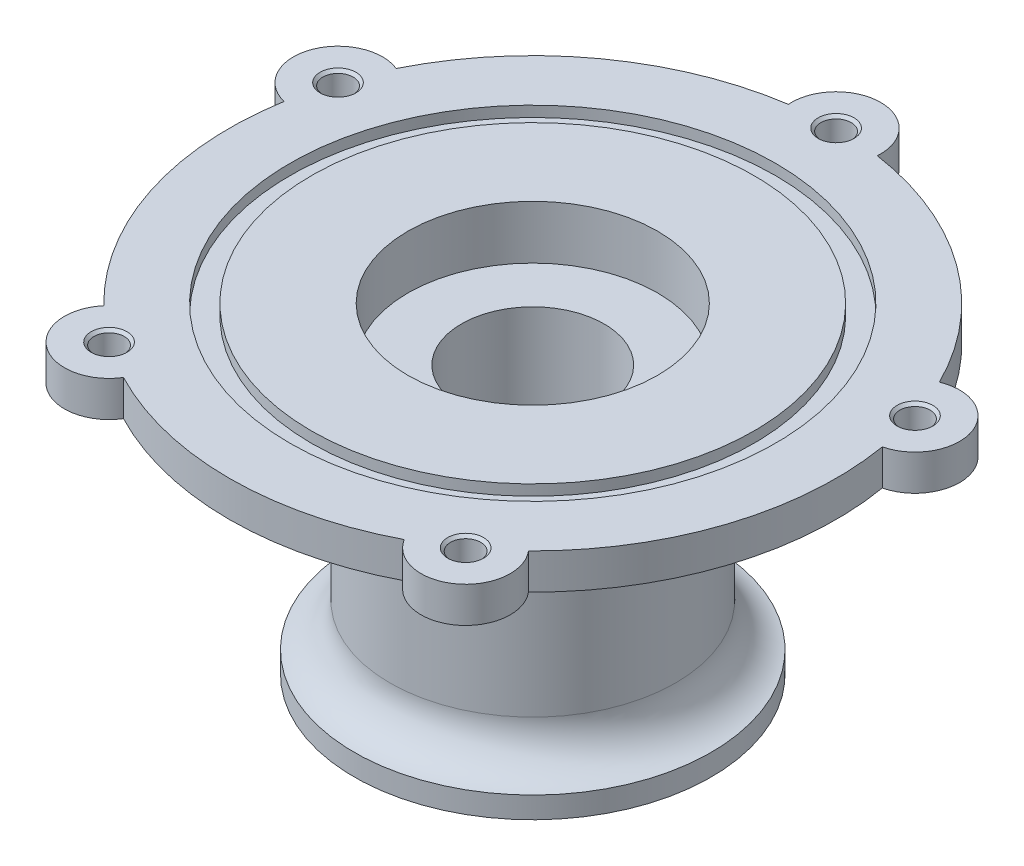
ISO-10303-21;
HEADER;
FILE_DESCRIPTION(('STEP AP214'),'2;1');
FILE_NAME('part.step','',(''),(''),'','','');
FILE_SCHEMA(('AUTOMOTIVE_DESIGN { 1 0 10303 214 1 1 1 1 }'));
ENDSEC;
DATA;
#1=APPLICATION_CONTEXT('core data for automotive mechanical design processes');
#2=APPLICATION_PROTOCOL_DEFINITION('international standard','automotive_design',2000,#1);
#3=PRODUCT_CONTEXT('',#1,'mechanical');
#4=PRODUCT('Part','Part','',(#3));
#5=PRODUCT_RELATED_PRODUCT_CATEGORY('part','',(#4));
#6=PRODUCT_DEFINITION_FORMATION('','',#4);
#7=PRODUCT_DEFINITION_CONTEXT('part definition',#1,'design');
#8=PRODUCT_DEFINITION('design','',#6,#7);
#9=PRODUCT_DEFINITION_SHAPE('','',#8);
#10=(LENGTH_UNIT() NAMED_UNIT(*) SI_UNIT(.MILLI.,.METRE.));
#11=(NAMED_UNIT(*) PLANE_ANGLE_UNIT() SI_UNIT($,.RADIAN.));
#12=(NAMED_UNIT(*) SI_UNIT($,.STERADIAN.) SOLID_ANGLE_UNIT());
#13=UNCERTAINTY_MEASURE_WITH_UNIT(LENGTH_MEASURE(1.E-05),#10,'distance_accuracy_value','');
#14=(GEOMETRIC_REPRESENTATION_CONTEXT(3) GLOBAL_UNCERTAINTY_ASSIGNED_CONTEXT((#13)) GLOBAL_UNIT_ASSIGNED_CONTEXT((#10,
#11,#12)) REPRESENTATION_CONTEXT('',''));
#15=CARTESIAN_POINT('',(0.,0.,0.));
#16=DIRECTION('',(0.,0.,1.));
#17=DIRECTION('',(1.,0.,0.));
#18=AXIS2_PLACEMENT_3D('',#15,#16,#17);
#19=CARTESIAN_POINT('',(0.,0.,0.));
#20=DIRECTION('',(0.,-1.,0.));
#21=DIRECTION('',(0.,0.,-1.));
#22=AXIS2_PLACEMENT_3D('',#19,#20,#21);
#23=CYLINDRICAL_SURFACE('',#22,85.);
#24=CARTESIAN_POINT('',(0.,80.,0.));
#25=DIRECTION('',(0.,-1.,0.));
#26=DIRECTION('',(0.,0.,-1.));
#27=AXIS2_PLACEMENT_3D('',#24,#25,#26);
#28=CIRCLE('',#27,85.);
#29=CARTESIAN_POINT('',(83.8179273140658,80.,-14.1263958876278));
#30=VERTEX_POINT('',#29);
#31=CARTESIAN_POINT('',(59.5068404595702,80.,60.6954358952901));
#32=VERTEX_POINT('',#31);
#33=EDGE_CURVE('E148',#30,#32,#28,.T.);
#34=ORIENTED_EDGE('',*,*,#33,.F.);
#35=DIRECTION('',(0.,1.,0.));
#36=VECTOR('',#35,1.);
#37=CARTESIAN_POINT('',(83.8179273140658,49.935394937421,-14.1263958876278));
#38=LINE('',#37,#36);
#39=CARTESIAN_POINT('',(83.8179273140658,90.,-14.1263958876278));
#40=VERTEX_POINT('',#39);
#41=EDGE_CURVE('E131',#30,#40,#38,.T.);
#42=ORIENTED_EDGE('',*,*,#41,.T.);
#43=CARTESIAN_POINT('',(0.,90.,0.));
#44=DIRECTION('',(0.,-1.,0.));
#45=DIRECTION('',(0.,0.,-1.));
#46=AXIS2_PLACEMENT_3D('',#43,#44,#45);
#47=CIRCLE('',#46,85.);
#48=CARTESIAN_POINT('',(59.5068404595702,90.,60.6954358952901));
#49=VERTEX_POINT('',#48);
#50=EDGE_CURVE('E146',#40,#49,#47,.T.);
#51=ORIENTED_EDGE('',*,*,#50,.T.);
#52=DIRECTION('',(0.,1.,0.));
#53=VECTOR('',#52,1.);
#54=CARTESIAN_POINT('',(59.5068404595702,49.0490885311223,60.6954358952901));
#55=LINE('',#54,#53);
#56=EDGE_CURVE('E238',#32,#49,#55,.T.);
#57=ORIENTED_EDGE('',*,*,#56,.F.);
#58=EDGE_LOOP('',(#34,#42,#51,#57));
#59=FACE_BOUND('',#58,.T.);
#60=ADVANCED_FACE('F49',(#59),#23,.T.);
#61=CARTESIAN_POINT('',(39.3361648340237,80.,75.3502895558506));
#62=VERTEX_POINT('',#61);
#63=CARTESIAN_POINT('',(-39.3361648340247,80.,75.35028955585));
#64=VERTEX_POINT('',#63);
#65=EDGE_CURVE('E332',#62,#64,#28,.T.);
#66=ORIENTED_EDGE('',*,*,#65,.F.);
#67=DIRECTION('',(0.,1.,0.));
#68=VECTOR('',#67,1.);
#69=CARTESIAN_POINT('',(39.3361648340237,49.0490885311223,75.3502895558506));
#70=LINE('',#69,#68);
#71=CARTESIAN_POINT('',(39.3361648340237,90.,75.3502895558506));
#72=VERTEX_POINT('',#71);
#73=EDGE_CURVE('E236',#62,#72,#70,.T.);
#74=ORIENTED_EDGE('',*,*,#73,.T.);
#75=CARTESIAN_POINT('',(-39.3361648340247,90.,75.35028955585));
#76=VERTEX_POINT('',#75);
#77=EDGE_CURVE('E157',#72,#76,#47,.T.);
#78=ORIENTED_EDGE('',*,*,#77,.T.);
#79=DIRECTION('',(0.,1.,0.));
#80=VECTOR('',#79,1.);
#81=CARTESIAN_POINT('',(-39.3361648340247,49.0490885311223,75.35028955585));
#82=LINE('',#81,#80);
#83=EDGE_CURVE('E252',#64,#76,#82,.T.);
#84=ORIENTED_EDGE('',*,*,#83,.F.);
#85=EDGE_LOOP('',(#66,#74,#78,#84));
#86=FACE_BOUND('',#85,.T.);
#87=ADVANCED_FACE('F345',(#86),#23,.T.);
#88=CARTESIAN_POINT('',(-59.506840459571,80.,60.6954358952892));
#89=VERTEX_POINT('',#88);
#90=CARTESIAN_POINT('',(-83.8179273140656,80.,-14.1263958876289));
#91=VERTEX_POINT('',#90);
#92=EDGE_CURVE('E326',#89,#91,#28,.T.);
#93=ORIENTED_EDGE('',*,*,#92,.F.);
#94=DIRECTION('',(0.,1.,0.));
#95=VECTOR('',#94,1.);
#96=CARTESIAN_POINT('',(-59.506840459571,49.0490885311223,60.6954358952892));
#97=LINE('',#96,#95);
#98=CARTESIAN_POINT('',(-59.506840459571,90.,60.6954358952892));
#99=VERTEX_POINT('',#98);
#100=EDGE_CURVE('E75',#89,#99,#97,.T.);
#101=ORIENTED_EDGE('',*,*,#100,.T.);
#102=CARTESIAN_POINT('',(-83.8179273140656,90.,-14.1263958876289));
#103=VERTEX_POINT('',#102);
#104=EDGE_CURVE('E164',#99,#103,#47,.T.);
#105=ORIENTED_EDGE('',*,*,#104,.T.);
#106=DIRECTION('',(0.,1.,0.));
#107=VECTOR('',#106,1.);
#108=CARTESIAN_POINT('',(-83.8179273140656,49.935394937421,-14.1263958876289));
#109=LINE('',#108,#107);
#110=EDGE_CURVE('E262',#91,#103,#109,.T.);
#111=ORIENTED_EDGE('',*,*,#110,.F.);
#112=EDGE_LOOP('',(#93,#101,#105,#111));
#113=FACE_BOUND('',#112,.T.);
#114=ADVANCED_FACE('F353',(#113),#23,.T.);
#115=CARTESIAN_POINT('',(-76.1134148011556,80.,-37.8384472105717));
#116=VERTEX_POINT('',#115);
#117=CARTESIAN_POINT('',(-12.4661631126367,80.,-84.0808823529412));
#118=VERTEX_POINT('',#117);
#119=EDGE_CURVE('E322',#116,#118,#28,.T.);
#120=ORIENTED_EDGE('',*,*,#119,.F.);
#121=DIRECTION('',(0.,1.,0.));
#122=VECTOR('',#121,1.);
#123=CARTESIAN_POINT('',(-76.1134148011556,49.935394937421,-37.8384472105718));
#124=LINE('',#123,#122);
#125=CARTESIAN_POINT('',(-76.1134148011556,90.,-37.8384472105718));
#126=VERTEX_POINT('',#125);
#127=EDGE_CURVE('E67',#116,#126,#124,.T.);
#128=ORIENTED_EDGE('',*,*,#127,.T.);
#129=CARTESIAN_POINT('',(-12.4661631126367,90.,-84.0808823529412));
#130=VERTEX_POINT('',#129);
#131=EDGE_CURVE('E162',#126,#130,#47,.T.);
#132=ORIENTED_EDGE('',*,*,#131,.T.);
#133=DIRECTION('',(0.,1.,0.));
#134=VECTOR('',#133,1.);
#135=CARTESIAN_POINT('',(-12.4661631126367,51.6261966168509,-84.0808823529412));
#136=LINE('',#135,#134);
#137=EDGE_CURVE('E273',#118,#130,#136,.T.);
#138=ORIENTED_EDGE('',*,*,#137,.F.);
#139=EDGE_LOOP('',(#120,#128,#132,#138));
#140=FACE_BOUND('',#139,.T.);
#141=ADVANCED_FACE('F356',(#140),#23,.T.);
#142=CARTESIAN_POINT('',(0.,90.,0.));
#143=DIRECTION('',(0.,-1.,0.));
#144=DIRECTION('',(0.,0.,-1.));
#145=AXIS2_PLACEMENT_3D('',#142,#143,#144);
#146=PLANE('',#145);
#147=CARTESIAN_POINT('',(0.,90.,0.));
#148=DIRECTION('',(0.,1.,0.));
#149=DIRECTION('',(0.,0.,1.));
#150=AXIS2_PLACEMENT_3D('',#147,#148,#149);
#151=CIRCLE('',#150,35.);
#152=CARTESIAN_POINT('',(0.,90.,35.));
#153=VERTEX_POINT('',#152);
#154=EDGE_CURVE('E297',#153,#153,#151,.T.);
#155=ORIENTED_EDGE('',*,*,#154,.F.);
#156=EDGE_LOOP('',(#155));
#157=FACE_BOUND('',#156,.T.);
#158=CARTESIAN_POINT('',(0.,90.,0.));
#159=DIRECTION('',(0.,1.,0.));
#160=DIRECTION('',(0.,0.,1.));
#161=AXIS2_PLACEMENT_3D('',#158,#159,#160);
#162=CIRCLE('',#161,62.);
#163=CARTESIAN_POINT('',(0.,90.,62.));
#164=VERTEX_POINT('',#163);
#165=EDGE_CURVE('E284',#164,#164,#162,.T.);
#166=ORIENTED_EDGE('',*,*,#165,.T.);
#167=EDGE_LOOP('',(#166));
#168=FACE_BOUND('',#167,.T.);
#169=ADVANCED_FACE('F377',(#157,#168),#146,.F.);
#170=CARTESIAN_POINT('',(49.9617464448598,90.,68.7664445218708));
#171=DIRECTION('',(0.,1.,0.));
#172=DIRECTION('',(0.,0.,1.));
#173=AXIS2_PLACEMENT_3D('',#170,#171,#172);
#174=CIRCLE('',#173,5.025);
#175=CARTESIAN_POINT('',(49.9617464448598,90.,73.7914445218708));
#176=VERTEX_POINT('',#175);
#177=EDGE_CURVE('E739',#176,#176,#174,.T.);
#178=ORIENTED_EDGE('',*,*,#177,.F.);
#179=EDGE_LOOP('',(#178));
#180=FACE_BOUND('',#179,.T.);
#181=CARTESIAN_POINT('',(-49.9617464448608,90.,68.7664445218701));
#182=DIRECTION('',(0.,1.,0.));
#183=DIRECTION('',(0.,0.,1.));
#184=AXIS2_PLACEMENT_3D('',#181,#182,#183);
#185=CIRCLE('',#184,5.025);
#186=CARTESIAN_POINT('',(-49.9617464448608,90.,73.7914445218701));
#187=VERTEX_POINT('',#186);
#188=EDGE_CURVE('E204',#187,#187,#185,.T.);
#189=ORIENTED_EDGE('',*,*,#188,.F.);
#190=EDGE_LOOP('',(#189));
#191=FACE_BOUND('',#190,.T.);
#192=CARTESIAN_POINT('',(80.8398038850882,90.,-26.2664445218703));
#193=DIRECTION('',(0.,1.,0.));
#194=DIRECTION('',(0.,0.,1.));
#195=AXIS2_PLACEMENT_3D('',#192,#193,#194);
#196=CIRCLE('',#195,5.025);
#197=CARTESIAN_POINT('',(80.8398038850882,90.,-21.2414445218703));
#198=VERTEX_POINT('',#197);
#199=EDGE_CURVE('E195',#198,#198,#196,.T.);
#200=ORIENTED_EDGE('',*,*,#199,.F.);
#201=EDGE_LOOP('',(#200));
#202=FACE_BOUND('',#201,.T.);
#203=CARTESIAN_POINT('',(0.,90.,-85.));
#204=DIRECTION('',(0.,1.,0.));
#205=DIRECTION('',(0.,0.,1.));
#206=AXIS2_PLACEMENT_3D('',#203,#204,#205);
#207=CIRCLE('',#206,5.025);
#208=CARTESIAN_POINT('',(0.,90.,-79.975));
#209=VERTEX_POINT('',#208);
#210=EDGE_CURVE('E190',#209,#209,#207,.T.);
#211=ORIENTED_EDGE('',*,*,#210,.F.);
#212=EDGE_LOOP('',(#211));
#213=FACE_BOUND('',#212,.T.);
#214=CARTESIAN_POINT('',(-80.8398038850878,90.,-26.2664445218715));
#215=DIRECTION('',(0.,1.,0.));
#216=DIRECTION('',(0.,0.,1.));
#217=AXIS2_PLACEMENT_3D('',#214,#215,#216);
#218=CIRCLE('',#217,5.025);
#219=CARTESIAN_POINT('',(-80.8398038850878,90.,-21.2414445218715));
#220=VERTEX_POINT('',#219);
#221=EDGE_CURVE('E185',#220,#220,#218,.T.);
#222=ORIENTED_EDGE('',*,*,#221,.F.);
#223=EDGE_LOOP('',(#222));
#224=FACE_BOUND('',#223,.T.);
#225=CARTESIAN_POINT('',(0.,90.,0.));
#226=DIRECTION('',(0.,1.,0.));
#227=DIRECTION('',(0.,0.,1.));
#228=AXIS2_PLACEMENT_3D('',#225,#226,#227);
#229=CIRCLE('',#228,68.);
#230=CARTESIAN_POINT('',(0.,90.,68.));
#231=VERTEX_POINT('',#230);
#232=EDGE_CURVE('E289',#231,#231,#229,.T.);
#233=ORIENTED_EDGE('',*,*,#232,.F.);
#234=EDGE_LOOP('',(#233));
#235=FACE_BOUND('',#234,.T.);
#236=CARTESIAN_POINT('',(12.4661631126367,90.,-84.0808823529412));
#237=VERTEX_POINT('',#236);
#238=CARTESIAN_POINT('',(76.1134148011562,90.,-37.8384472105707));
#239=VERTEX_POINT('',#238);
#240=EDGE_CURVE('E156',#237,#239,#47,.T.);
#241=ORIENTED_EDGE('',*,*,#240,.F.);
#242=CARTESIAN_POINT('',(0.,90.,-85.));
#243=DIRECTION('',(0.,1.,0.));
#244=DIRECTION('',(0.,0.,1.));
#245=AXIS2_PLACEMENT_3D('',#242,#243,#244);
#246=CIRCLE('',#245,12.5);
#247=EDGE_CURVE('E233',#237,#130,#246,.T.);
#248=ORIENTED_EDGE('',*,*,#247,.T.);
#249=ORIENTED_EDGE('',*,*,#131,.F.);
#250=CARTESIAN_POINT('',(-80.8398038850878,90.,-26.2664445218715));
#251=DIRECTION('',(0.,1.,0.));
#252=DIRECTION('',(0.95105651629515,0.,0.309016994374958));
#253=AXIS2_PLACEMENT_3D('',#250,#251,#252);
#254=CIRCLE('',#253,12.5);
#255=EDGE_CURVE('E179',#126,#103,#254,.T.);
#256=ORIENTED_EDGE('',*,*,#255,.T.);
#257=ORIENTED_EDGE('',*,*,#104,.F.);
#258=CARTESIAN_POINT('',(-49.9617464448608,90.,68.7664445218701));
#259=DIRECTION('',(0.,1.,0.));
#260=DIRECTION('',(0.58778525229248,0.,-0.809016994374942));
#261=AXIS2_PLACEMENT_3D('',#258,#259,#260);
#262=CIRCLE('',#261,12.5);
#263=EDGE_CURVE('E247',#99,#76,#262,.T.);
#264=ORIENTED_EDGE('',*,*,#263,.T.);
#265=ORIENTED_EDGE('',*,*,#77,.F.);
#266=CARTESIAN_POINT('',(49.9617464448598,90.,68.7664445218708));
#267=DIRECTION('',(0.,1.,0.));
#268=DIRECTION('',(-0.587785252292469,0.,-0.809016994374951));
#269=AXIS2_PLACEMENT_3D('',#266,#267,#268);
#270=CIRCLE('',#269,12.5);
#271=EDGE_CURVE('E154',#72,#49,#270,.T.);
#272=ORIENTED_EDGE('',*,*,#271,.T.);
#273=ORIENTED_EDGE('',*,*,#50,.F.);
#274=CARTESIAN_POINT('',(80.8398038850882,90.,-26.2664445218703));
#275=DIRECTION('',(0.,1.,0.));
#276=DIRECTION('',(-0.951056516295155,0.,0.309016994374945));
#277=AXIS2_PLACEMENT_3D('',#274,#275,#276);
#278=CIRCLE('',#277,12.5);
#279=EDGE_CURVE('E128',#40,#239,#278,.T.);
#280=ORIENTED_EDGE('',*,*,#279,.T.);
#281=EDGE_LOOP('',(#241,#248,#249,#256,#257,#264,#265,#272,#273,#280));
#282=FACE_BOUND('',#281,.T.);
#283=ADVANCED_FACE('F152',(#180,#191,#202,#213,#224,#235,#282),#146,.F.);
#284=CARTESIAN_POINT('',(-50.,0.,0.));
#285=DIRECTION('',(0.,1.,0.));
#286=DIRECTION('',(0.,0.,1.));
#287=AXIS2_PLACEMENT_3D('',#284,#285,#286);
#288=PLANE('',#287);
#289=CARTESIAN_POINT('',(0.,0.,0.));
#290=DIRECTION('',(0.,1.,0.));
#291=DIRECTION('',(0.,0.,1.));
#292=AXIS2_PLACEMENT_3D('',#289,#290,#291);
#293=CIRCLE('',#292,20.);
#294=CARTESIAN_POINT('',(0.,0.,20.));
#295=VERTEX_POINT('',#294);
#296=EDGE_CURVE('E312',#295,#295,#293,.T.);
#297=ORIENTED_EDGE('',*,*,#296,.T.);
#298=EDGE_LOOP('',(#297));
#299=FACE_BOUND('',#298,.T.);
#300=CARTESIAN_POINT('',(0.,0.,0.));
#301=DIRECTION('',(0.,-1.,0.));
#302=DIRECTION('',(0.,0.,-1.));
#303=AXIS2_PLACEMENT_3D('',#300,#301,#302);
#304=CIRCLE('',#303,50.);
#305=CARTESIAN_POINT('',(0.,0.,-50.));
#306=VERTEX_POINT('',#305);
#307=EDGE_CURVE('E316',#306,#306,#304,.T.);
#308=ORIENTED_EDGE('',*,*,#307,.T.);
#309=EDGE_LOOP('',(#308));
#310=FACE_BOUND('',#309,.T.);
#311=ADVANCED_FACE('F362',(#299,#310),#288,.F.);
#312=ORIENTED_EDGE('',*,*,#240,.T.);
#313=DIRECTION('',(0.,1.,0.));
#314=VECTOR('',#313,1.);
#315=CARTESIAN_POINT('',(76.1134148011562,49.935394937421,-37.8384472105707));
#316=LINE('',#315,#314);
#317=CARTESIAN_POINT('',(76.1134148011562,80.,-37.8384472105707));
#318=VERTEX_POINT('',#317);
#319=EDGE_CURVE('E134',#318,#239,#316,.T.);
#320=ORIENTED_EDGE('',*,*,#319,.F.);
#321=CARTESIAN_POINT('',(12.4661631126367,80.,-84.0808823529412));
#322=VERTEX_POINT('',#321);
#323=EDGE_CURVE('E167',#322,#318,#28,.T.);
#324=ORIENTED_EDGE('',*,*,#323,.F.);
#325=DIRECTION('',(0.,1.,0.));
#326=VECTOR('',#325,1.);
#327=CARTESIAN_POINT('',(12.4661631126367,51.6261966168509,-84.0808823529412));
#328=LINE('',#327,#326);
#329=EDGE_CURVE('E272',#322,#237,#328,.T.);
#330=ORIENTED_EDGE('',*,*,#329,.T.);
#331=EDGE_LOOP('',(#312,#320,#324,#330));
#332=FACE_BOUND('',#331,.T.);
#333=ADVANCED_FACE('F360',(#332),#23,.T.);
#334=CARTESIAN_POINT('',(-85.,80.,0.));
#335=DIRECTION('',(0.,1.,0.));
#336=DIRECTION('',(0.,0.,1.));
#337=AXIS2_PLACEMENT_3D('',#334,#335,#336);
#338=PLANE('',#337);
#339=CARTESIAN_POINT('',(49.9617464448598,80.,68.7664445218708));
#340=DIRECTION('',(0.,1.,0.));
#341=DIRECTION('',(0.,0.,1.));
#342=AXIS2_PLACEMENT_3D('',#339,#340,#341);
#343=CIRCLE('',#342,4.24999999999999);
#344=CARTESIAN_POINT('',(49.9617464448598,80.,73.0164445218708));
#345=VERTEX_POINT('',#344);
#346=EDGE_CURVE('E53',#345,#345,#343,.T.);
#347=ORIENTED_EDGE('',*,*,#346,.T.);
#348=EDGE_LOOP('',(#347));
#349=FACE_BOUND('',#348,.T.);
#350=CARTESIAN_POINT('',(-49.9617464448608,80.,68.7664445218701));
#351=DIRECTION('',(0.,1.,0.));
#352=DIRECTION('',(0.,0.,1.));
#353=AXIS2_PLACEMENT_3D('',#350,#351,#352);
#354=CIRCLE('',#353,4.24999999999999);
#355=CARTESIAN_POINT('',(-49.9617464448608,80.,73.0164445218701));
#356=VERTEX_POINT('',#355);
#357=EDGE_CURVE('E192',#356,#356,#354,.T.);
#358=ORIENTED_EDGE('',*,*,#357,.T.);
#359=EDGE_LOOP('',(#358));
#360=FACE_BOUND('',#359,.T.);
#361=CARTESIAN_POINT('',(80.8398038850882,80.,-26.2664445218703));
#362=DIRECTION('',(0.,1.,0.));
#363=DIRECTION('',(0.,0.,1.));
#364=AXIS2_PLACEMENT_3D('',#361,#362,#363);
#365=CIRCLE('',#364,4.25);
#366=CARTESIAN_POINT('',(80.8398038850882,80.,-22.0164445218703));
#367=VERTEX_POINT('',#366);
#368=EDGE_CURVE('E187',#367,#367,#365,.T.);
#369=ORIENTED_EDGE('',*,*,#368,.T.);
#370=EDGE_LOOP('',(#369));
#371=FACE_BOUND('',#370,.T.);
#372=CARTESIAN_POINT('',(0.,80.,-85.));
#373=DIRECTION('',(0.,1.,0.));
#374=DIRECTION('',(0.,0.,1.));
#375=AXIS2_PLACEMENT_3D('',#372,#373,#374);
#376=CIRCLE('',#375,4.24999999999999);
#377=CARTESIAN_POINT('',(0.,80.,-80.75));
#378=VERTEX_POINT('',#377);
#379=EDGE_CURVE('E181',#378,#378,#376,.T.);
#380=ORIENTED_EDGE('',*,*,#379,.T.);
#381=EDGE_LOOP('',(#380));
#382=FACE_BOUND('',#381,.T.);
#383=CARTESIAN_POINT('',(-80.8398038850878,80.,-26.2664445218715));
#384=DIRECTION('',(0.,1.,0.));
#385=DIRECTION('',(0.,0.,1.));
#386=AXIS2_PLACEMENT_3D('',#383,#384,#385);
#387=CIRCLE('',#386,4.25);
#388=CARTESIAN_POINT('',(-80.8398038850878,80.,-22.0164445218715));
#389=VERTEX_POINT('',#388);
#390=EDGE_CURVE('E175',#389,#389,#387,.T.);
#391=ORIENTED_EDGE('',*,*,#390,.T.);
#392=EDGE_LOOP('',(#391));
#393=FACE_BOUND('',#392,.T.);
#394=CARTESIAN_POINT('',(0.,80.,0.));
#395=DIRECTION('',(0.,1.,0.));
#396=DIRECTION('',(0.,0.,1.));
#397=AXIS2_PLACEMENT_3D('',#394,#395,#396);
#398=CIRCLE('',#397,61.);
#399=CARTESIAN_POINT('',(0.,80.,61.));
#400=VERTEX_POINT('',#399);
#401=EDGE_CURVE('E59',#400,#400,#398,.T.);
#402=ORIENTED_EDGE('',*,*,#401,.T.);
#403=EDGE_LOOP('',(#402));
#404=FACE_BOUND('',#403,.T.);
#405=ORIENTED_EDGE('',*,*,#323,.T.);
#406=CARTESIAN_POINT('',(80.8398038850882,80.,-26.2664445218703));
#407=DIRECTION('',(0.,1.,0.));
#408=DIRECTION('',(0.,0.,1.));
#409=AXIS2_PLACEMENT_3D('',#406,#407,#408);
#410=CIRCLE('',#409,12.5);
#411=EDGE_CURVE('E229',#318,#30,#410,.F.);
#412=ORIENTED_EDGE('',*,*,#411,.T.);
#413=ORIENTED_EDGE('',*,*,#33,.T.);
#414=CARTESIAN_POINT('',(49.9617464448598,80.,68.7664445218708));
#415=DIRECTION('',(0.,1.,0.));
#416=DIRECTION('',(0.,0.,1.));
#417=AXIS2_PLACEMENT_3D('',#414,#415,#416);
#418=CIRCLE('',#417,12.5);
#419=EDGE_CURVE('E140',#32,#62,#418,.F.);
#420=ORIENTED_EDGE('',*,*,#419,.T.);
#421=ORIENTED_EDGE('',*,*,#65,.T.);
#422=CARTESIAN_POINT('',(-49.9617464448608,80.,68.7664445218701));
#423=DIRECTION('',(0.,1.,0.));
#424=DIRECTION('',(0.,0.,1.));
#425=AXIS2_PLACEMENT_3D('',#422,#423,#424);
#426=CIRCLE('',#425,12.5);
#427=EDGE_CURVE('E237',#64,#89,#426,.F.);
#428=ORIENTED_EDGE('',*,*,#427,.T.);
#429=ORIENTED_EDGE('',*,*,#92,.T.);
#430=CARTESIAN_POINT('',(-80.8398038850878,80.,-26.2664445218715));
#431=DIRECTION('',(0.,1.,0.));
#432=DIRECTION('',(0.,0.,1.));
#433=AXIS2_PLACEMENT_3D('',#430,#431,#432);
#434=CIRCLE('',#433,12.5);
#435=EDGE_CURVE('E251',#91,#116,#434,.F.);
#436=ORIENTED_EDGE('',*,*,#435,.T.);
#437=ORIENTED_EDGE('',*,*,#119,.T.);
#438=CARTESIAN_POINT('',(0.,80.,-85.));
#439=DIRECTION('',(0.,1.,0.));
#440=DIRECTION('',(0.,0.,1.));
#441=AXIS2_PLACEMENT_3D('',#438,#439,#440);
#442=CIRCLE('',#441,12.5);
#443=EDGE_CURVE('E277',#118,#322,#442,.F.);
#444=ORIENTED_EDGE('',*,*,#443,.T.);
#445=EDGE_LOOP('',(#405,#412,#413,#420,#421,#428,#429,#436,#437,#444));
#446=FACE_BOUND('',#445,.T.);
#447=ADVANCED_FACE('F341',(#349,#360,#371,#382,#393,#404,#446),#338,.F.);
#448=CARTESIAN_POINT('',(0.,0.,0.));
#449=DIRECTION('',(0.,-1.,0.));
#450=DIRECTION('',(0.,0.,-1.));
#451=AXIS2_PLACEMENT_3D('',#448,#449,#450);
#452=CYLINDRICAL_SURFACE('',#451,40.);
#453=CARTESIAN_POINT('',(0.,17.8321595661992,0.));
#454=DIRECTION('',(0.,-1.,0.));
#455=DIRECTION('',(0.,0.,-1.));
#456=AXIS2_PLACEMENT_3D('',#453,#454,#455);
#457=CIRCLE('',#456,40.);
#458=CARTESIAN_POINT('',(0.,17.8321595661992,-40.));
#459=VERTEX_POINT('',#458);
#460=EDGE_CURVE('E11',#459,#459,#457,.F.);
#461=ORIENTED_EDGE('',*,*,#460,.T.);
#462=EDGE_LOOP('',(#461));
#463=FACE_BOUND('',#462,.T.);
#464=CARTESIAN_POINT('',(0.,59.,0.));
#465=DIRECTION('',(0.,1.,0.));
#466=DIRECTION('',(0.,0.,1.));
#467=AXIS2_PLACEMENT_3D('',#464,#465,#466);
#468=CIRCLE('',#467,40.);
#469=CARTESIAN_POINT('',(0.,59.,40.));
#470=VERTEX_POINT('',#469);
#471=EDGE_CURVE('E161',#470,#470,#468,.F.);
#472=ORIENTED_EDGE('',*,*,#471,.T.);
#473=EDGE_LOOP('',(#472));
#474=FACE_BOUND('',#473,.T.);
#475=ADVANCED_FACE('F369',(#463,#474),#452,.T.);
#476=CARTESIAN_POINT('',(0.,0.,0.));
#477=DIRECTION('',(0.,-1.,0.));
#478=DIRECTION('',(0.,0.,-1.));
#479=AXIS2_PLACEMENT_3D('',#476,#477,#478);
#480=CYLINDRICAL_SURFACE('',#479,50.);
#481=ORIENTED_EDGE('',*,*,#307,.F.);
#482=EDGE_LOOP('',(#481));
#483=FACE_BOUND('',#482,.T.);
#484=CARTESIAN_POINT('',(0.,6.,0.));
#485=DIRECTION('',(0.,-1.,0.));
#486=DIRECTION('',(0.,0.,-1.));
#487=AXIS2_PLACEMENT_3D('',#484,#485,#486);
#488=CIRCLE('',#487,50.);
#489=CARTESIAN_POINT('',(0.,6.,-50.));
#490=VERTEX_POINT('',#489);
#491=EDGE_CURVE('E319',#490,#490,#488,.T.);
#492=ORIENTED_EDGE('',*,*,#491,.T.);
#493=EDGE_LOOP('',(#492));
#494=FACE_BOUND('',#493,.T.);
#495=ADVANCED_FACE('F419',(#483,#494),#480,.T.);
#496=CARTESIAN_POINT('',(0.,90.,0.));
#497=DIRECTION('',(0.,1.,0.));
#498=DIRECTION('',(0.,0.,1.));
#499=AXIS2_PLACEMENT_3D('',#496,#497,#498);
#500=CYLINDRICAL_SURFACE('',#499,20.);
#501=ORIENTED_EDGE('',*,*,#296,.F.);
#502=EDGE_LOOP('',(#501));
#503=FACE_BOUND('',#502,.T.);
#504=CARTESIAN_POINT('',(0.,75.,0.));
#505=DIRECTION('',(0.,1.,0.));
#506=DIRECTION('',(0.,0.,1.));
#507=AXIS2_PLACEMENT_3D('',#504,#505,#506);
#508=CIRCLE('',#507,20.);
#509=CARTESIAN_POINT('',(0.,75.,20.));
#510=VERTEX_POINT('',#509);
#511=EDGE_CURVE('E308',#510,#510,#508,.T.);
#512=ORIENTED_EDGE('',*,*,#511,.T.);
#513=EDGE_LOOP('',(#512));
#514=FACE_BOUND('',#513,.T.);
#515=ADVANCED_FACE('F478',(#503,#514),#500,.F.);
#516=CARTESIAN_POINT('',(20.,75.,0.));
#517=DIRECTION('',(0.,-1.,0.));
#518=DIRECTION('',(0.,0.,-1.));
#519=AXIS2_PLACEMENT_3D('',#516,#517,#518);
#520=PLANE('',#519);
#521=ORIENTED_EDGE('',*,*,#511,.F.);
#522=EDGE_LOOP('',(#521));
#523=FACE_BOUND('',#522,.T.);
#524=CARTESIAN_POINT('',(0.,75.,0.));
#525=DIRECTION('',(0.,1.,0.));
#526=DIRECTION('',(0.,0.,1.));
#527=AXIS2_PLACEMENT_3D('',#524,#525,#526);
#528=CIRCLE('',#527,35.);
#529=CARTESIAN_POINT('',(0.,75.,35.));
#530=VERTEX_POINT('',#529);
#531=EDGE_CURVE('E304',#530,#530,#528,.T.);
#532=ORIENTED_EDGE('',*,*,#531,.T.);
#533=EDGE_LOOP('',(#532));
#534=FACE_BOUND('',#533,.T.);
#535=ADVANCED_FACE('F469',(#523,#534),#520,.F.);
#536=CARTESIAN_POINT('',(0.,90.,0.));
#537=DIRECTION('',(0.,1.,0.));
#538=DIRECTION('',(0.,0.,1.));
#539=AXIS2_PLACEMENT_3D('',#536,#537,#538);
#540=CYLINDRICAL_SURFACE('',#539,35.);
#541=ORIENTED_EDGE('',*,*,#531,.F.);
#542=EDGE_LOOP('',(#541));
#543=FACE_BOUND('',#542,.T.);
#544=ORIENTED_EDGE('',*,*,#154,.T.);
#545=EDGE_LOOP('',(#544));
#546=FACE_BOUND('',#545,.T.);
#547=ADVANCED_FACE('F454',(#543,#546),#540,.F.);
#548=CARTESIAN_POINT('',(0.,87.,0.));
#549=DIRECTION('',(0.,1.,0.));
#550=DIRECTION('',(0.,0.,1.));
#551=AXIS2_PLACEMENT_3D('',#548,#549,#550);
#552=CYLINDRICAL_SURFACE('',#551,68.);
#553=CARTESIAN_POINT('',(0.,87.,0.));
#554=DIRECTION('',(0.,1.,0.));
#555=DIRECTION('',(0.,0.,1.));
#556=AXIS2_PLACEMENT_3D('',#553,#554,#555);
#557=CIRCLE('',#556,68.);
#558=CARTESIAN_POINT('',(0.,87.,68.));
#559=VERTEX_POINT('',#558);
#560=EDGE_CURVE('E293',#559,#559,#557,.T.);
#561=ORIENTED_EDGE('',*,*,#560,.F.);
#562=EDGE_LOOP('',(#561));
#563=FACE_BOUND('',#562,.T.);
#564=ORIENTED_EDGE('',*,*,#232,.T.);
#565=EDGE_LOOP('',(#564));
#566=FACE_BOUND('',#565,.T.);
#567=ADVANCED_FACE('F446',(#563,#566),#552,.F.);
#568=CARTESIAN_POINT('',(0.,87.,0.));
#569=DIRECTION('',(0.,1.,0.));
#570=DIRECTION('',(0.,0.,1.));
#571=AXIS2_PLACEMENT_3D('',#568,#569,#570);
#572=PLANE('',#571);
#573=CARTESIAN_POINT('',(0.,87.,0.));
#574=DIRECTION('',(0.,1.,0.));
#575=DIRECTION('',(0.,0.,1.));
#576=AXIS2_PLACEMENT_3D('',#573,#574,#575);
#577=CIRCLE('',#576,62.);
#578=CARTESIAN_POINT('',(0.,87.,62.));
#579=VERTEX_POINT('',#578);
#580=EDGE_CURVE('E285',#579,#579,#577,.T.);
#581=ORIENTED_EDGE('',*,*,#580,.F.);
#582=EDGE_LOOP('',(#581));
#583=FACE_BOUND('',#582,.T.);
#584=ORIENTED_EDGE('',*,*,#560,.T.);
#585=EDGE_LOOP('',(#584));
#586=FACE_BOUND('',#585,.T.);
#587=ADVANCED_FACE('F437',(#583,#586),#572,.T.);
#588=CARTESIAN_POINT('',(0.,87.,0.));
#589=DIRECTION('',(0.,1.,0.));
#590=DIRECTION('',(0.,0.,1.));
#591=AXIS2_PLACEMENT_3D('',#588,#589,#590);
#592=CYLINDRICAL_SURFACE('',#591,62.);
#593=ORIENTED_EDGE('',*,*,#580,.T.);
#594=EDGE_LOOP('',(#593));
#595=FACE_BOUND('',#594,.T.);
#596=ORIENTED_EDGE('',*,*,#165,.F.);
#597=EDGE_LOOP('',(#596));
#598=FACE_BOUND('',#597,.T.);
#599=ADVANCED_FACE('F429',(#595,#598),#592,.T.);
#600=CARTESIAN_POINT('',(0.,59.,0.));
#601=DIRECTION('',(0.,1.,0.));
#602=DIRECTION('',(0.,0.,1.));
#603=AXIS2_PLACEMENT_3D('',#600,#601,#602);
#604=TOROIDAL_SURFACE('',#603,61.,21.);
#605=ORIENTED_EDGE('',*,*,#401,.F.);
#606=EDGE_LOOP('',(#605));
#607=FACE_BOUND('',#606,.T.);
#608=ORIENTED_EDGE('',*,*,#471,.F.);
#609=EDGE_LOOP('',(#608));
#610=FACE_BOUND('',#609,.T.);
#611=ADVANCED_FACE('F409',(#607,#610),#604,.F.);
#612=CARTESIAN_POINT('',(0.,17.8321595661992,0.));
#613=DIRECTION('',(0.,-1.,0.));
#614=DIRECTION('',(0.,0.,-1.));
#615=AXIS2_PLACEMENT_3D('',#612,#613,#614);
#616=TOROIDAL_SURFACE('',#615,52.,12.);
#617=ORIENTED_EDGE('',*,*,#460,.F.);
#618=EDGE_LOOP('',(#617));
#619=FACE_BOUND('',#618,.T.);
#620=ORIENTED_EDGE('',*,*,#491,.F.);
#621=EDGE_LOOP('',(#620));
#622=FACE_BOUND('',#621,.T.);
#623=ADVANCED_FACE('F51',(#619,#622),#616,.F.);
#624=CARTESIAN_POINT('',(0.,51.6261966168509,-85.));
#625=DIRECTION('',(0.,1.,0.));
#626=DIRECTION('',(0.,0.,1.));
#627=AXIS2_PLACEMENT_3D('',#624,#625,#626);
#628=CYLINDRICAL_SURFACE('',#627,12.5);
#629=ORIENTED_EDGE('',*,*,#443,.F.);
#630=ORIENTED_EDGE('',*,*,#137,.T.);
#631=ORIENTED_EDGE('',*,*,#247,.F.);
#632=ORIENTED_EDGE('',*,*,#329,.F.);
#633=EDGE_LOOP('',(#629,#630,#631,#632));
#634=FACE_BOUND('',#633,.T.);
#635=ADVANCED_FACE('F358',(#634),#628,.T.);
#636=CARTESIAN_POINT('',(-80.8398038850878,49.935394937421,-26.2664445218715));
#637=DIRECTION('',(0.,1.,0.));
#638=DIRECTION('',(0.,0.,1.));
#639=AXIS2_PLACEMENT_3D('',#636,#637,#638);
#640=CYLINDRICAL_SURFACE('',#639,12.5);
#641=ORIENTED_EDGE('',*,*,#435,.F.);
#642=ORIENTED_EDGE('',*,*,#110,.T.);
#643=ORIENTED_EDGE('',*,*,#255,.F.);
#644=ORIENTED_EDGE('',*,*,#127,.F.);
#645=EDGE_LOOP('',(#641,#642,#643,#644));
#646=FACE_BOUND('',#645,.T.);
#647=ADVANCED_FACE('F399',(#646),#640,.T.);
#648=CARTESIAN_POINT('',(-49.9617464448608,49.0490885311223,68.7664445218701));
#649=DIRECTION('',(0.,1.,0.));
#650=DIRECTION('',(0.,0.,1.));
#651=AXIS2_PLACEMENT_3D('',#648,#649,#650);
#652=CYLINDRICAL_SURFACE('',#651,12.5);
#653=ORIENTED_EDGE('',*,*,#427,.F.);
#654=ORIENTED_EDGE('',*,*,#83,.T.);
#655=ORIENTED_EDGE('',*,*,#263,.F.);
#656=ORIENTED_EDGE('',*,*,#100,.F.);
#657=EDGE_LOOP('',(#653,#654,#655,#656));
#658=FACE_BOUND('',#657,.T.);
#659=ADVANCED_FACE('F346',(#658),#652,.T.);
#660=CARTESIAN_POINT('',(49.9617464448598,49.0490885311223,68.7664445218708));
#661=DIRECTION('',(0.,1.,0.));
#662=DIRECTION('',(0.,0.,1.));
#663=AXIS2_PLACEMENT_3D('',#660,#661,#662);
#664=CYLINDRICAL_SURFACE('',#663,12.5);
#665=ORIENTED_EDGE('',*,*,#419,.F.);
#666=ORIENTED_EDGE('',*,*,#56,.T.);
#667=ORIENTED_EDGE('',*,*,#271,.F.);
#668=ORIENTED_EDGE('',*,*,#73,.F.);
#669=EDGE_LOOP('',(#665,#666,#667,#668));
#670=FACE_BOUND('',#669,.T.);
#671=ADVANCED_FACE('F578',(#670),#664,.T.);
#672=CARTESIAN_POINT('',(80.8398038850882,49.935394937421,-26.2664445218703));
#673=DIRECTION('',(0.,1.,0.));
#674=DIRECTION('',(0.,0.,1.));
#675=AXIS2_PLACEMENT_3D('',#672,#673,#674);
#676=CYLINDRICAL_SURFACE('',#675,12.5);
#677=ORIENTED_EDGE('',*,*,#411,.F.);
#678=ORIENTED_EDGE('',*,*,#319,.T.);
#679=ORIENTED_EDGE('',*,*,#279,.F.);
#680=ORIENTED_EDGE('',*,*,#41,.F.);
#681=EDGE_LOOP('',(#677,#678,#679,#680));
#682=FACE_BOUND('',#681,.T.);
#683=ADVANCED_FACE('F130',(#682),#676,.T.);
#684=CARTESIAN_POINT('',(-80.8398038850878,90.,-26.2664445218715));
#685=DIRECTION('',(0.,1.,0.));
#686=DIRECTION('',(0.,0.,1.));
#687=AXIS2_PLACEMENT_3D('',#684,#685,#686);
#688=CYLINDRICAL_SURFACE('',#687,4.25);
#689=CARTESIAN_POINT('',(-80.8398038850878,89.225,-26.2664445218715));
#690=DIRECTION('',(0.,1.,0.));
#691=DIRECTION('',(0.,0.,1.));
#692=AXIS2_PLACEMENT_3D('',#689,#690,#691);
#693=CIRCLE('',#692,4.25);
#694=CARTESIAN_POINT('',(-80.8398038850878,89.225,-22.0164445218715));
#695=VERTEX_POINT('',#694);
#696=EDGE_CURVE('E180',#695,#695,#693,.T.);
#697=ORIENTED_EDGE('',*,*,#696,.T.);
#698=EDGE_LOOP('',(#697));
#699=FACE_BOUND('',#698,.T.);
#700=ORIENTED_EDGE('',*,*,#390,.F.);
#701=EDGE_LOOP('',(#700));
#702=FACE_BOUND('',#701,.T.);
#703=ADVANCED_FACE('F595',(#699,#702),#688,.F.);
#704=CARTESIAN_POINT('',(-80.8398038850878,90.,-26.2664445218715));
#705=DIRECTION('',(0.,1.,0.));
#706=DIRECTION('',(0.,0.,1.));
#707=AXIS2_PLACEMENT_3D('',#704,#705,#706);
#708=CONICAL_SURFACE('',#707,5.025,0.785398163397448);
#709=ORIENTED_EDGE('',*,*,#696,.F.);
#710=EDGE_LOOP('',(#709));
#711=FACE_BOUND('',#710,.T.);
#712=ORIENTED_EDGE('',*,*,#221,.T.);
#713=EDGE_LOOP('',(#712));
#714=FACE_BOUND('',#713,.T.);
#715=ADVANCED_FACE('F604',(#711,#714),#708,.F.);
#716=CARTESIAN_POINT('',(0.,90.,-85.));
#717=DIRECTION('',(0.,1.,0.));
#718=DIRECTION('',(0.,0.,1.));
#719=AXIS2_PLACEMENT_3D('',#716,#717,#718);
#720=CYLINDRICAL_SURFACE('',#719,4.24999999999999);
#721=CARTESIAN_POINT('',(0.,89.225,-85.));
#722=DIRECTION('',(0.,1.,0.));
#723=DIRECTION('',(0.,0.,1.));
#724=AXIS2_PLACEMENT_3D('',#721,#722,#723);
#725=CIRCLE('',#724,4.25);
#726=CARTESIAN_POINT('',(0.,89.225,-80.75));
#727=VERTEX_POINT('',#726);
#728=EDGE_CURVE('E186',#727,#727,#725,.T.);
#729=ORIENTED_EDGE('',*,*,#728,.T.);
#730=EDGE_LOOP('',(#729));
#731=FACE_BOUND('',#730,.T.);
#732=ORIENTED_EDGE('',*,*,#379,.F.);
#733=EDGE_LOOP('',(#732));
#734=FACE_BOUND('',#733,.T.);
#735=ADVANCED_FACE('F616',(#731,#734),#720,.F.);
#736=CARTESIAN_POINT('',(0.,90.,-85.));
#737=DIRECTION('',(0.,1.,0.));
#738=DIRECTION('',(0.,0.,1.));
#739=AXIS2_PLACEMENT_3D('',#736,#737,#738);
#740=CONICAL_SURFACE('',#739,5.025,0.785398163397452);
#741=ORIENTED_EDGE('',*,*,#728,.F.);
#742=EDGE_LOOP('',(#741));
#743=FACE_BOUND('',#742,.T.);
#744=ORIENTED_EDGE('',*,*,#210,.T.);
#745=EDGE_LOOP('',(#744));
#746=FACE_BOUND('',#745,.T.);
#747=ADVANCED_FACE('F627',(#743,#746),#740,.F.);
#748=CARTESIAN_POINT('',(80.8398038850882,90.,-26.2664445218703));
#749=DIRECTION('',(0.,1.,0.));
#750=DIRECTION('',(0.,0.,1.));
#751=AXIS2_PLACEMENT_3D('',#748,#749,#750);
#752=CYLINDRICAL_SURFACE('',#751,4.25);
#753=CARTESIAN_POINT('',(80.8398038850882,89.225,-26.2664445218703));
#754=DIRECTION('',(0.,1.,0.));
#755=DIRECTION('',(0.,0.,1.));
#756=AXIS2_PLACEMENT_3D('',#753,#754,#755);
#757=CIRCLE('',#756,4.25);
#758=CARTESIAN_POINT('',(80.8398038850882,89.225,-22.0164445218703));
#759=VERTEX_POINT('',#758);
#760=EDGE_CURVE('E191',#759,#759,#757,.T.);
#761=ORIENTED_EDGE('',*,*,#760,.T.);
#762=EDGE_LOOP('',(#761));
#763=FACE_BOUND('',#762,.T.);
#764=ORIENTED_EDGE('',*,*,#368,.F.);
#765=EDGE_LOOP('',(#764));
#766=FACE_BOUND('',#765,.T.);
#767=ADVANCED_FACE('F639',(#763,#766),#752,.F.);
#768=CARTESIAN_POINT('',(80.8398038850882,90.,-26.2664445218703));
#769=DIRECTION('',(0.,1.,0.));
#770=DIRECTION('',(0.,0.,1.));
#771=AXIS2_PLACEMENT_3D('',#768,#769,#770);
#772=CONICAL_SURFACE('',#771,5.025,0.785398163397448);
#773=ORIENTED_EDGE('',*,*,#760,.F.);
#774=EDGE_LOOP('',(#773));
#775=FACE_BOUND('',#774,.T.);
#776=ORIENTED_EDGE('',*,*,#199,.T.);
#777=EDGE_LOOP('',(#776));
#778=FACE_BOUND('',#777,.T.);
#779=ADVANCED_FACE('F650',(#775,#778),#772,.F.);
#780=CARTESIAN_POINT('',(-49.9617464448608,90.,68.7664445218701));
#781=DIRECTION('',(0.,1.,0.));
#782=DIRECTION('',(0.,0.,1.));
#783=AXIS2_PLACEMENT_3D('',#780,#781,#782);
#784=CYLINDRICAL_SURFACE('',#783,4.24999999999999);
#785=CARTESIAN_POINT('',(-49.9617464448608,89.225,68.7664445218701));
#786=DIRECTION('',(0.,1.,0.));
#787=DIRECTION('',(0.,0.,1.));
#788=AXIS2_PLACEMENT_3D('',#785,#786,#787);
#789=CIRCLE('',#788,4.25);
#790=CARTESIAN_POINT('',(-49.9617464448608,89.225,73.0164445218701));
#791=VERTEX_POINT('',#790);
#792=EDGE_CURVE('E196',#791,#791,#789,.T.);
#793=ORIENTED_EDGE('',*,*,#792,.T.);
#794=EDGE_LOOP('',(#793));
#795=FACE_BOUND('',#794,.T.);
#796=ORIENTED_EDGE('',*,*,#357,.F.);
#797=EDGE_LOOP('',(#796));
#798=FACE_BOUND('',#797,.T.);
#799=ADVANCED_FACE('F662',(#795,#798),#784,.F.);
#800=CARTESIAN_POINT('',(-49.9617464448608,90.,68.7664445218701));
#801=DIRECTION('',(0.,1.,0.));
#802=DIRECTION('',(0.,0.,1.));
#803=AXIS2_PLACEMENT_3D('',#800,#801,#802);
#804=CONICAL_SURFACE('',#803,5.025,0.785398163397453);
#805=ORIENTED_EDGE('',*,*,#792,.F.);
#806=EDGE_LOOP('',(#805));
#807=FACE_BOUND('',#806,.T.);
#808=ORIENTED_EDGE('',*,*,#188,.T.);
#809=EDGE_LOOP('',(#808));
#810=FACE_BOUND('',#809,.T.);
#811=ADVANCED_FACE('F673',(#807,#810),#804,.F.);
#812=CARTESIAN_POINT('',(49.9617464448598,90.,68.7664445218708));
#813=DIRECTION('',(0.,1.,0.));
#814=DIRECTION('',(0.,0.,1.));
#815=AXIS2_PLACEMENT_3D('',#812,#813,#814);
#816=CYLINDRICAL_SURFACE('',#815,4.24999999999999);
#817=CARTESIAN_POINT('',(49.9617464448598,89.225,68.7664445218708));
#818=DIRECTION('',(0.,1.,0.));
#819=DIRECTION('',(0.,0.,1.));
#820=AXIS2_PLACEMENT_3D('',#817,#818,#819);
#821=CIRCLE('',#820,4.25);
#822=CARTESIAN_POINT('',(49.9617464448598,89.225,73.0164445218708));
#823=VERTEX_POINT('',#822);
#824=EDGE_CURVE('E736',#823,#823,#821,.T.);
#825=ORIENTED_EDGE('',*,*,#824,.T.);
#826=EDGE_LOOP('',(#825));
#827=FACE_BOUND('',#826,.T.);
#828=ORIENTED_EDGE('',*,*,#346,.F.);
#829=EDGE_LOOP('',(#828));
#830=FACE_BOUND('',#829,.T.);
#831=ADVANCED_FACE('F684',(#827,#830),#816,.F.);
#832=CARTESIAN_POINT('',(49.9617464448598,90.,68.7664445218708));
#833=DIRECTION('',(0.,1.,0.));
#834=DIRECTION('',(0.,0.,1.));
#835=AXIS2_PLACEMENT_3D('',#832,#833,#834);
#836=CONICAL_SURFACE('',#835,5.025,0.785398163397453);
#837=ORIENTED_EDGE('',*,*,#824,.F.);
#838=EDGE_LOOP('',(#837));
#839=FACE_BOUND('',#838,.T.);
#840=ORIENTED_EDGE('',*,*,#177,.T.);
#841=EDGE_LOOP('',(#840));
#842=FACE_BOUND('',#841,.T.);
#843=ADVANCED_FACE('F695',(#839,#842),#836,.F.);
#844=CLOSED_SHELL('',(#60,#87,#114,#141,#169,#283,#311,#333,#447,#475,#495,#515,#535,#547,#567,
#587,#599,#611,#623,#635,#647,#659,#671,#683,#703,#715,#735,#747,#767,#779,#799,#811,#831,#843));
#845=MANIFOLD_SOLID_BREP('B2',#844);
#846=ADVANCED_BREP_SHAPE_REPRESENTATION('',(#18,#845),#14);
#847=SHAPE_DEFINITION_REPRESENTATION(#9,#846);
ENDSEC;
END-ISO-10303-21;
